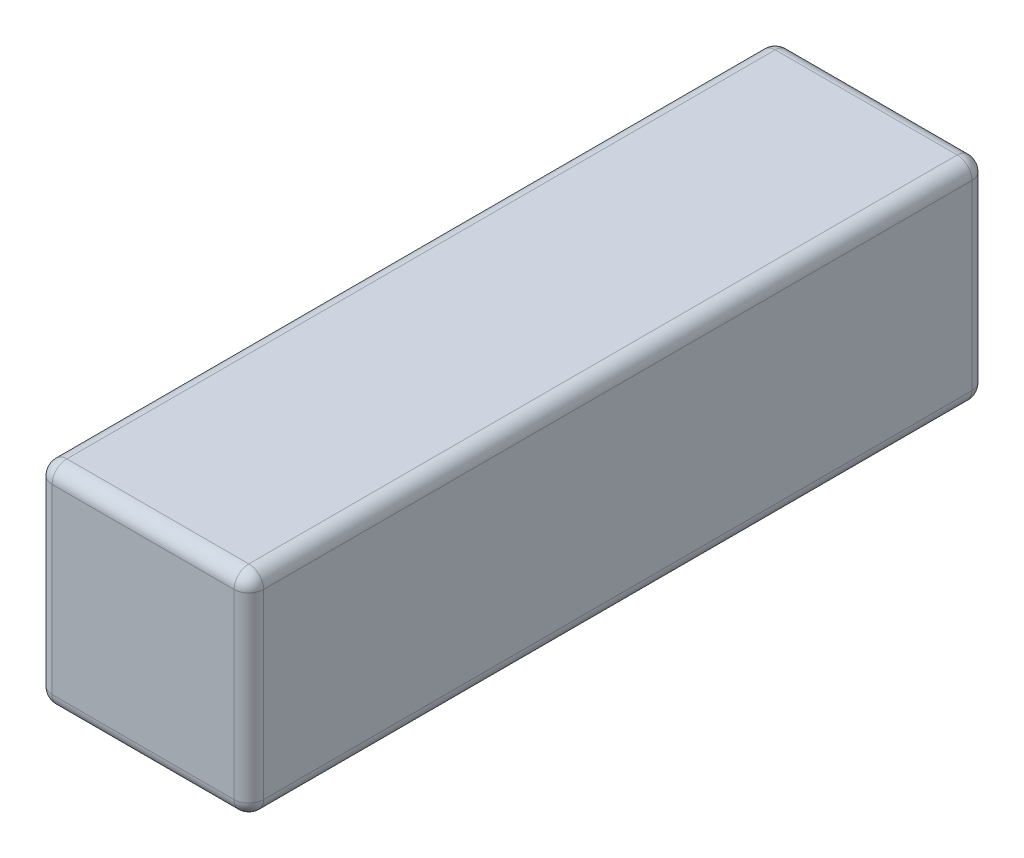
ISO-10303-21;
HEADER;
FILE_DESCRIPTION(('STEP AP214'),'2;1');
FILE_NAME('part.step','',(''),(''),'','','');
FILE_SCHEMA(('AUTOMOTIVE_DESIGN { 1 0 10303 214 1 1 1 1 }'));
ENDSEC;
DATA;
#1=APPLICATION_CONTEXT('core data for automotive mechanical design processes');
#2=APPLICATION_PROTOCOL_DEFINITION('international standard','automotive_design',2000,#1);
#3=PRODUCT_CONTEXT('',#1,'mechanical');
#4=PRODUCT('Part','Part','',(#3));
#5=PRODUCT_RELATED_PRODUCT_CATEGORY('part','',(#4));
#6=PRODUCT_DEFINITION_FORMATION('','',#4);
#7=PRODUCT_DEFINITION_CONTEXT('part definition',#1,'design');
#8=PRODUCT_DEFINITION('design','',#6,#7);
#9=PRODUCT_DEFINITION_SHAPE('','',#8);
#10=(LENGTH_UNIT() NAMED_UNIT(*) SI_UNIT(.MILLI.,.METRE.));
#11=(NAMED_UNIT(*) PLANE_ANGLE_UNIT() SI_UNIT($,.RADIAN.));
#12=(NAMED_UNIT(*) SI_UNIT($,.STERADIAN.) SOLID_ANGLE_UNIT());
#13=UNCERTAINTY_MEASURE_WITH_UNIT(LENGTH_MEASURE(1.E-05),#10,'distance_accuracy_value','');
#14=(GEOMETRIC_REPRESENTATION_CONTEXT(3) GLOBAL_UNCERTAINTY_ASSIGNED_CONTEXT((#13)) GLOBAL_UNIT_ASSIGNED_CONTEXT((#10,
#11,#12)) REPRESENTATION_CONTEXT('',''));
#15=CARTESIAN_POINT('',(0.,0.,0.));
#16=DIRECTION('',(0.,0.,1.));
#17=DIRECTION('',(1.,0.,0.));
#18=AXIS2_PLACEMENT_3D('',#15,#16,#17);
#19=CARTESIAN_POINT('',(-18.5,21.5,72.));
#20=DIRECTION('',(0.,-1.,0.));
#21=DIRECTION('',(0.,0.,-1.));
#22=AXIS2_PLACEMENT_3D('',#19,#20,#21);
#23=CYLINDRICAL_SURFACE('',#22,3.);
#24=DIRECTION('',(0.,-1.,0.));
#25=VECTOR('',#24,1.);
#26=CARTESIAN_POINT('',(-21.5,21.5,72.));
#27=LINE('',#26,#25);
#28=CARTESIAN_POINT('',(-21.5,18.5,72.));
#29=VERTEX_POINT('',#28);
#30=CARTESIAN_POINT('',(-21.5,-18.5,72.));
#31=VERTEX_POINT('',#30);
#32=EDGE_CURVE('E240',#29,#31,#27,.T.);
#33=ORIENTED_EDGE('',*,*,#32,.T.);
#34=CARTESIAN_POINT('',(-18.5,-18.5,72.));
#35=DIRECTION('',(0.,-1.,0.));
#36=DIRECTION('',(0.,0.,-1.));
#37=AXIS2_PLACEMENT_3D('',#34,#35,#36);
#38=CIRCLE('',#37,3.);
#39=CARTESIAN_POINT('',(-18.5,-18.5,75.));
#40=VERTEX_POINT('',#39);
#41=EDGE_CURVE('E295',#31,#40,#38,.F.);
#42=ORIENTED_EDGE('',*,*,#41,.T.);
#43=DIRECTION('',(0.,-1.,0.));
#44=VECTOR('',#43,1.);
#45=CARTESIAN_POINT('',(-18.5,21.5,75.));
#46=LINE('',#45,#44);
#47=CARTESIAN_POINT('',(-18.5,18.5,75.));
#48=VERTEX_POINT('',#47);
#49=EDGE_CURVE('E169',#48,#40,#46,.T.);
#50=ORIENTED_EDGE('',*,*,#49,.F.);
#51=CARTESIAN_POINT('',(-18.5,18.5,72.));
#52=DIRECTION('',(0.,-1.,0.));
#53=DIRECTION('',(0.,0.,-1.));
#54=AXIS2_PLACEMENT_3D('',#51,#52,#53);
#55=CIRCLE('',#54,3.);
#56=EDGE_CURVE('E292',#48,#29,#55,.T.);
#57=ORIENTED_EDGE('',*,*,#56,.T.);
#58=EDGE_LOOP('',(#33,#42,#50,#57));
#59=FACE_BOUND('',#58,.T.);
#60=ADVANCED_FACE('F45',(#59),#23,.T.);
#61=CARTESIAN_POINT('',(-18.5,21.5,75.));
#62=DIRECTION('',(0.,0.,-1.));
#63=DIRECTION('',(-1.,0.,0.));
#64=AXIS2_PLACEMENT_3D('',#61,#62,#63);
#65=PLANE('',#64);
#66=ORIENTED_EDGE('',*,*,#49,.T.);
#67=DIRECTION('',(1.,0.,0.));
#68=VECTOR('',#67,1.);
#69=CARTESIAN_POINT('',(-18.5,-18.5,75.));
#70=LINE('',#69,#68);
#71=CARTESIAN_POINT('',(18.5,-18.5,75.));
#72=VERTEX_POINT('',#71);
#73=EDGE_CURVE('E276',#40,#72,#70,.T.);
#74=ORIENTED_EDGE('',*,*,#73,.T.);
#75=DIRECTION('',(0.,-1.,0.));
#76=VECTOR('',#75,1.);
#77=CARTESIAN_POINT('',(18.5,21.5,75.));
#78=LINE('',#77,#76);
#79=CARTESIAN_POINT('',(18.5,18.5,75.));
#80=VERTEX_POINT('',#79);
#81=EDGE_CURVE('E160',#80,#72,#78,.T.);
#82=ORIENTED_EDGE('',*,*,#81,.F.);
#83=DIRECTION('',(1.,0.,0.));
#84=VECTOR('',#83,1.);
#85=CARTESIAN_POINT('',(-18.5,18.5,75.));
#86=LINE('',#85,#84);
#87=EDGE_CURVE('E273',#80,#48,#86,.F.);
#88=ORIENTED_EDGE('',*,*,#87,.T.);
#89=EDGE_LOOP('',(#66,#74,#82,#88));
#90=FACE_BOUND('',#89,.T.);
#91=ADVANCED_FACE('F336',(#90),#65,.F.);
#92=CARTESIAN_POINT('',(18.5,21.5,72.));
#93=DIRECTION('',(0.,-1.,0.));
#94=DIRECTION('',(0.,0.,-1.));
#95=AXIS2_PLACEMENT_3D('',#92,#93,#94);
#96=CYLINDRICAL_SURFACE('',#95,3.);
#97=ORIENTED_EDGE('',*,*,#81,.T.);
#98=CARTESIAN_POINT('',(18.5,-18.5,72.));
#99=DIRECTION('',(0.,-1.,0.));
#100=DIRECTION('',(0.,0.,-1.));
#101=AXIS2_PLACEMENT_3D('',#98,#99,#100);
#102=CIRCLE('',#101,3.);
#103=CARTESIAN_POINT('',(21.5,-18.5,72.));
#104=VERTEX_POINT('',#103);
#105=EDGE_CURVE('E158',#72,#104,#102,.F.);
#106=ORIENTED_EDGE('',*,*,#105,.T.);
#107=DIRECTION('',(0.,-1.,0.));
#108=VECTOR('',#107,1.);
#109=CARTESIAN_POINT('',(21.5,21.5,72.));
#110=LINE('',#109,#108);
#111=CARTESIAN_POINT('',(21.5,18.5,72.));
#112=VERTEX_POINT('',#111);
#113=EDGE_CURVE('E139',#112,#104,#110,.T.);
#114=ORIENTED_EDGE('',*,*,#113,.F.);
#115=CARTESIAN_POINT('',(18.5,18.5,72.));
#116=DIRECTION('',(0.,-1.,0.));
#117=DIRECTION('',(0.,0.,-1.));
#118=AXIS2_PLACEMENT_3D('',#115,#116,#117);
#119=CIRCLE('',#118,3.);
#120=EDGE_CURVE('E155',#112,#80,#119,.T.);
#121=ORIENTED_EDGE('',*,*,#120,.T.);
#122=EDGE_LOOP('',(#97,#106,#114,#121));
#123=FACE_BOUND('',#122,.T.);
#124=ADVANCED_FACE('F154',(#123),#96,.T.);
#125=CARTESIAN_POINT('',(21.5,21.5,72.));
#126=DIRECTION('',(-1.,0.,0.));
#127=DIRECTION('',(0.,0.,1.));
#128=AXIS2_PLACEMENT_3D('',#125,#126,#127);
#129=PLANE('',#128);
#130=ORIENTED_EDGE('',*,*,#113,.T.);
#131=DIRECTION('',(0.,0.,-1.));
#132=VECTOR('',#131,1.);
#133=CARTESIAN_POINT('',(21.5,-18.5,72.));
#134=LINE('',#133,#132);
#135=CARTESIAN_POINT('',(21.5,-18.5,-72.));
#136=VERTEX_POINT('',#135);
#137=EDGE_CURVE('E11',#104,#136,#134,.T.);
#138=ORIENTED_EDGE('',*,*,#137,.T.);
#139=DIRECTION('',(0.,-1.,0.));
#140=VECTOR('',#139,1.);
#141=CARTESIAN_POINT('',(21.5,21.5,-72.));
#142=LINE('',#141,#140);
#143=CARTESIAN_POINT('',(21.5,18.5,-72.));
#144=VERTEX_POINT('',#143);
#145=EDGE_CURVE('E141',#144,#136,#142,.T.);
#146=ORIENTED_EDGE('',*,*,#145,.F.);
#147=DIRECTION('',(0.,0.,-1.));
#148=VECTOR('',#147,1.);
#149=CARTESIAN_POINT('',(21.5,18.5,72.));
#150=LINE('',#149,#148);
#151=EDGE_CURVE('E55',#144,#112,#150,.F.);
#152=ORIENTED_EDGE('',*,*,#151,.T.);
#153=EDGE_LOOP('',(#130,#138,#146,#152));
#154=FACE_BOUND('',#153,.T.);
#155=ADVANCED_FACE('F138',(#154),#129,.F.);
#156=CARTESIAN_POINT('',(18.5,21.5,-72.));
#157=DIRECTION('',(0.,-1.,0.));
#158=DIRECTION('',(0.,0.,-1.));
#159=AXIS2_PLACEMENT_3D('',#156,#157,#158);
#160=CYLINDRICAL_SURFACE('',#159,3.);
#161=ORIENTED_EDGE('',*,*,#145,.T.);
#162=CARTESIAN_POINT('',(18.5,-18.5,-72.));
#163=DIRECTION('',(0.,-1.,0.));
#164=DIRECTION('',(0.,0.,-1.));
#165=AXIS2_PLACEMENT_3D('',#162,#163,#164);
#166=CIRCLE('',#165,3.);
#167=CARTESIAN_POINT('',(18.5,-18.5,-75.));
#168=VERTEX_POINT('',#167);
#169=EDGE_CURVE('E319',#136,#168,#166,.F.);
#170=ORIENTED_EDGE('',*,*,#169,.T.);
#171=DIRECTION('',(0.,-1.,0.));
#172=VECTOR('',#171,1.);
#173=CARTESIAN_POINT('',(18.5,21.5,-75.));
#174=LINE('',#173,#172);
#175=CARTESIAN_POINT('',(18.5,18.5,-75.));
#176=VERTEX_POINT('',#175);
#177=EDGE_CURVE('E260',#176,#168,#174,.T.);
#178=ORIENTED_EDGE('',*,*,#177,.F.);
#179=CARTESIAN_POINT('',(18.5,18.5,-72.));
#180=DIRECTION('',(0.,-1.,0.));
#181=DIRECTION('',(0.,0.,-1.));
#182=AXIS2_PLACEMENT_3D('',#179,#180,#181);
#183=CIRCLE('',#182,3.);
#184=EDGE_CURVE('E316',#176,#144,#183,.T.);
#185=ORIENTED_EDGE('',*,*,#184,.T.);
#186=EDGE_LOOP('',(#161,#170,#178,#185));
#187=FACE_BOUND('',#186,.T.);
#188=ADVANCED_FACE('F359',(#187),#160,.T.);
#189=CARTESIAN_POINT('',(-18.5,21.5,-75.));
#190=DIRECTION('',(0.,0.,1.));
#191=DIRECTION('',(1.,0.,0.));
#192=AXIS2_PLACEMENT_3D('',#189,#190,#191);
#193=PLANE('',#192);
#194=ORIENTED_EDGE('',*,*,#177,.T.);
#195=DIRECTION('',(-1.,0.,0.));
#196=VECTOR('',#195,1.);
#197=CARTESIAN_POINT('',(-18.5,-18.5,-75.));
#198=LINE('',#197,#196);
#199=CARTESIAN_POINT('',(-18.5,-18.5,-75.));
#200=VERTEX_POINT('',#199);
#201=EDGE_CURVE('E313',#168,#200,#198,.T.);
#202=ORIENTED_EDGE('',*,*,#201,.T.);
#203=DIRECTION('',(0.,-1.,0.));
#204=VECTOR('',#203,1.);
#205=CARTESIAN_POINT('',(-18.5,21.5,-75.));
#206=LINE('',#205,#204);
#207=CARTESIAN_POINT('',(-18.5,18.5,-75.));
#208=VERTEX_POINT('',#207);
#209=EDGE_CURVE('E254',#208,#200,#206,.T.);
#210=ORIENTED_EDGE('',*,*,#209,.F.);
#211=DIRECTION('',(-1.,0.,0.));
#212=VECTOR('',#211,1.);
#213=CARTESIAN_POINT('',(18.5,18.5,-75.));
#214=LINE('',#213,#212);
#215=EDGE_CURVE('E310',#208,#176,#214,.F.);
#216=ORIENTED_EDGE('',*,*,#215,.T.);
#217=EDGE_LOOP('',(#194,#202,#210,#216));
#218=FACE_BOUND('',#217,.T.);
#219=ADVANCED_FACE('F357',(#218),#193,.F.);
#220=CARTESIAN_POINT('',(-18.5,21.5,-72.));
#221=DIRECTION('',(0.,-1.,0.));
#222=DIRECTION('',(0.,0.,-1.));
#223=AXIS2_PLACEMENT_3D('',#220,#221,#222);
#224=CYLINDRICAL_SURFACE('',#223,3.);
#225=ORIENTED_EDGE('',*,*,#209,.T.);
#226=CARTESIAN_POINT('',(-18.5,-18.5,-72.));
#227=DIRECTION('',(0.,-1.,0.));
#228=DIRECTION('',(0.,0.,-1.));
#229=AXIS2_PLACEMENT_3D('',#226,#227,#228);
#230=CIRCLE('',#229,3.);
#231=CARTESIAN_POINT('',(-21.5,-18.5,-72.));
#232=VERTEX_POINT('',#231);
#233=EDGE_CURVE('E307',#200,#232,#230,.F.);
#234=ORIENTED_EDGE('',*,*,#233,.T.);
#235=DIRECTION('',(0.,-1.,0.));
#236=VECTOR('',#235,1.);
#237=CARTESIAN_POINT('',(-21.5,21.5,-72.));
#238=LINE('',#237,#236);
#239=CARTESIAN_POINT('',(-21.5,18.5,-72.));
#240=VERTEX_POINT('',#239);
#241=EDGE_CURVE('E247',#240,#232,#238,.T.);
#242=ORIENTED_EDGE('',*,*,#241,.F.);
#243=CARTESIAN_POINT('',(-18.5,18.5,-72.));
#244=DIRECTION('',(0.,-1.,0.));
#245=DIRECTION('',(0.,0.,-1.));
#246=AXIS2_PLACEMENT_3D('',#243,#244,#245);
#247=CIRCLE('',#246,3.);
#248=EDGE_CURVE('E304',#240,#208,#247,.T.);
#249=ORIENTED_EDGE('',*,*,#248,.T.);
#250=EDGE_LOOP('',(#225,#234,#242,#249));
#251=FACE_BOUND('',#250,.T.);
#252=ADVANCED_FACE('F348',(#251),#224,.T.);
#253=CARTESIAN_POINT('',(-21.5,21.5,72.));
#254=DIRECTION('',(1.,0.,0.));
#255=DIRECTION('',(0.,0.,-1.));
#256=AXIS2_PLACEMENT_3D('',#253,#254,#255);
#257=PLANE('',#256);
#258=ORIENTED_EDGE('',*,*,#241,.T.);
#259=DIRECTION('',(0.,0.,1.));
#260=VECTOR('',#259,1.);
#261=CARTESIAN_POINT('',(-21.5,-18.5,72.));
#262=LINE('',#261,#260);
#263=EDGE_CURVE('E301',#232,#31,#262,.T.);
#264=ORIENTED_EDGE('',*,*,#263,.T.);
#265=ORIENTED_EDGE('',*,*,#32,.F.);
#266=DIRECTION('',(0.,0.,1.));
#267=VECTOR('',#266,1.);
#268=CARTESIAN_POINT('',(-21.5,18.5,-72.));
#269=LINE('',#268,#267);
#270=EDGE_CURVE('E298',#29,#240,#269,.F.);
#271=ORIENTED_EDGE('',*,*,#270,.T.);
#272=EDGE_LOOP('',(#258,#264,#265,#271));
#273=FACE_BOUND('',#272,.T.);
#274=ADVANCED_FACE('F345',(#273),#257,.F.);
#275=CARTESIAN_POINT('',(-18.5,21.5,72.));
#276=DIRECTION('',(0.,1.,0.));
#277=DIRECTION('',(0.,0.,1.));
#278=AXIS2_PLACEMENT_3D('',#275,#276,#277);
#279=PLANE('',#278);
#280=DIRECTION('',(0.,0.,1.));
#281=VECTOR('',#280,1.);
#282=CARTESIAN_POINT('',(-18.5,21.5,72.));
#283=LINE('',#282,#281);
#284=CARTESIAN_POINT('',(-18.5,21.5,-72.));
#285=VERTEX_POINT('',#284);
#286=CARTESIAN_POINT('',(-18.5,21.5,72.));
#287=VERTEX_POINT('',#286);
#288=EDGE_CURVE('E63',#285,#287,#283,.T.);
#289=ORIENTED_EDGE('',*,*,#288,.T.);
#290=DIRECTION('',(1.,0.,0.));
#291=VECTOR('',#290,1.);
#292=CARTESIAN_POINT('',(18.5,21.5,72.));
#293=LINE('',#292,#291);
#294=CARTESIAN_POINT('',(18.5,21.5,72.));
#295=VERTEX_POINT('',#294);
#296=EDGE_CURVE('E147',#287,#295,#293,.T.);
#297=ORIENTED_EDGE('',*,*,#296,.T.);
#298=DIRECTION('',(0.,0.,-1.));
#299=VECTOR('',#298,1.);
#300=CARTESIAN_POINT('',(18.5,21.5,-72.));
#301=LINE('',#300,#299);
#302=CARTESIAN_POINT('',(18.5,21.5,-72.));
#303=VERTEX_POINT('',#302);
#304=EDGE_CURVE('E173',#295,#303,#301,.T.);
#305=ORIENTED_EDGE('',*,*,#304,.T.);
#306=DIRECTION('',(-1.,0.,0.));
#307=VECTOR('',#306,1.);
#308=CARTESIAN_POINT('',(-18.5,21.5,-72.));
#309=LINE('',#308,#307);
#310=EDGE_CURVE('E68',#303,#285,#309,.T.);
#311=ORIENTED_EDGE('',*,*,#310,.T.);
#312=EDGE_LOOP('',(#289,#297,#305,#311));
#313=FACE_BOUND('',#312,.T.);
#314=ADVANCED_FACE('F330',(#313),#279,.T.);
#315=CARTESIAN_POINT('',(-18.5,-21.5,72.));
#316=DIRECTION('',(0.,1.,0.));
#317=DIRECTION('',(0.,0.,1.));
#318=AXIS2_PLACEMENT_3D('',#315,#316,#317);
#319=PLANE('',#318);
#320=DIRECTION('',(0.,0.,-1.));
#321=VECTOR('',#320,1.);
#322=CARTESIAN_POINT('',(18.5,-21.5,72.));
#323=LINE('',#322,#321);
#324=CARTESIAN_POINT('',(18.5,-21.5,-72.));
#325=VERTEX_POINT('',#324);
#326=CARTESIAN_POINT('',(18.5,-21.5,72.));
#327=VERTEX_POINT('',#326);
#328=EDGE_CURVE('E279',#325,#327,#323,.F.);
#329=ORIENTED_EDGE('',*,*,#328,.T.);
#330=DIRECTION('',(1.,0.,0.));
#331=VECTOR('',#330,1.);
#332=CARTESIAN_POINT('',(-18.5,-21.5,72.));
#333=LINE('',#332,#331);
#334=CARTESIAN_POINT('',(-18.5,-21.5,72.));
#335=VERTEX_POINT('',#334);
#336=EDGE_CURVE('E288',#327,#335,#333,.F.);
#337=ORIENTED_EDGE('',*,*,#336,.T.);
#338=DIRECTION('',(0.,0.,1.));
#339=VECTOR('',#338,1.);
#340=CARTESIAN_POINT('',(-18.5,-21.5,72.));
#341=LINE('',#340,#339);
#342=CARTESIAN_POINT('',(-18.5,-21.5,-72.));
#343=VERTEX_POINT('',#342);
#344=EDGE_CURVE('E285',#335,#343,#341,.F.);
#345=ORIENTED_EDGE('',*,*,#344,.T.);
#346=DIRECTION('',(-1.,0.,0.));
#347=VECTOR('',#346,1.);
#348=CARTESIAN_POINT('',(-18.5,-21.5,-72.));
#349=LINE('',#348,#347);
#350=EDGE_CURVE('E282',#343,#325,#349,.F.);
#351=ORIENTED_EDGE('',*,*,#350,.T.);
#352=EDGE_LOOP('',(#329,#337,#345,#351));
#353=FACE_BOUND('',#352,.T.);
#354=ADVANCED_FACE('F370',(#353),#319,.F.);
#355=CARTESIAN_POINT('',(-18.5,-18.5,-72.));
#356=DIRECTION('',(0.,1.,0.));
#357=DIRECTION('',(0.,0.,1.));
#358=AXIS2_PLACEMENT_3D('',#355,#356,#357);
#359=SPHERICAL_SURFACE('',#358,3.);
#360=CARTESIAN_POINT('',(-18.5,-18.5,-72.));
#361=DIRECTION('',(1.,0.,0.));
#362=DIRECTION('',(0.,0.,-1.));
#363=AXIS2_PLACEMENT_3D('',#360,#361,#362);
#364=CIRCLE('',#363,3.);
#365=EDGE_CURVE('E231',#343,#200,#364,.T.);
#366=ORIENTED_EDGE('',*,*,#365,.F.);
#367=CARTESIAN_POINT('',(-18.5,-18.5,-72.));
#368=DIRECTION('',(0.,0.,1.));
#369=DIRECTION('',(1.,0.,0.));
#370=AXIS2_PLACEMENT_3D('',#367,#368,#369);
#371=CIRCLE('',#370,3.);
#372=EDGE_CURVE('E180',#232,#343,#371,.T.);
#373=ORIENTED_EDGE('',*,*,#372,.F.);
#374=ORIENTED_EDGE('',*,*,#233,.F.);
#375=EDGE_LOOP('',(#366,#373,#374));
#376=FACE_BOUND('',#375,.T.);
#377=ADVANCED_FACE('F404',(#376),#359,.T.);
#378=CARTESIAN_POINT('',(-18.5,-18.5,72.));
#379=DIRECTION('',(0.,0.,1.));
#380=DIRECTION('',(1.,0.,0.));
#381=AXIS2_PLACEMENT_3D('',#378,#379,#380);
#382=CYLINDRICAL_SURFACE('',#381,3.);
#383=ORIENTED_EDGE('',*,*,#372,.T.);
#384=ORIENTED_EDGE('',*,*,#344,.F.);
#385=CARTESIAN_POINT('',(-18.5,-18.5,72.));
#386=DIRECTION('',(0.,0.,1.));
#387=DIRECTION('',(1.,0.,0.));
#388=AXIS2_PLACEMENT_3D('',#385,#386,#387);
#389=CIRCLE('',#388,3.);
#390=EDGE_CURVE('E228',#31,#335,#389,.T.);
#391=ORIENTED_EDGE('',*,*,#390,.F.);
#392=ORIENTED_EDGE('',*,*,#263,.F.);
#393=EDGE_LOOP('',(#383,#384,#391,#392));
#394=FACE_BOUND('',#393,.T.);
#395=ADVANCED_FACE('F422',(#394),#382,.T.);
#396=CARTESIAN_POINT('',(-18.5,-18.5,-72.));
#397=DIRECTION('',(-1.,0.,0.));
#398=DIRECTION('',(0.,0.,1.));
#399=AXIS2_PLACEMENT_3D('',#396,#397,#398);
#400=CYLINDRICAL_SURFACE('',#399,3.);
#401=ORIENTED_EDGE('',*,*,#365,.T.);
#402=ORIENTED_EDGE('',*,*,#201,.F.);
#403=CARTESIAN_POINT('',(18.5,-18.5,-72.));
#404=DIRECTION('',(1.,0.,0.));
#405=DIRECTION('',(0.,0.,-1.));
#406=AXIS2_PLACEMENT_3D('',#403,#404,#405);
#407=CIRCLE('',#406,3.);
#408=EDGE_CURVE('E224',#325,#168,#407,.T.);
#409=ORIENTED_EDGE('',*,*,#408,.F.);
#410=ORIENTED_EDGE('',*,*,#350,.F.);
#411=EDGE_LOOP('',(#401,#402,#409,#410));
#412=FACE_BOUND('',#411,.T.);
#413=ADVANCED_FACE('F431',(#412),#400,.T.);
#414=CARTESIAN_POINT('',(-18.5,-18.5,72.));
#415=DIRECTION('',(0.,1.,0.));
#416=DIRECTION('',(0.,0.,1.));
#417=AXIS2_PLACEMENT_3D('',#414,#415,#416);
#418=SPHERICAL_SURFACE('',#417,3.);
#419=ORIENTED_EDGE('',*,*,#41,.F.);
#420=ORIENTED_EDGE('',*,*,#390,.T.);
#421=CARTESIAN_POINT('',(-18.5,-18.5,72.));
#422=DIRECTION('',(1.,0.,0.));
#423=DIRECTION('',(0.,0.,-1.));
#424=AXIS2_PLACEMENT_3D('',#421,#422,#423);
#425=CIRCLE('',#424,3.);
#426=EDGE_CURVE('E221',#40,#335,#425,.T.);
#427=ORIENTED_EDGE('',*,*,#426,.F.);
#428=EDGE_LOOP('',(#419,#420,#427));
#429=FACE_BOUND('',#428,.T.);
#430=ADVANCED_FACE('F439',(#429),#418,.T.);
#431=CARTESIAN_POINT('',(18.5,-18.5,-72.));
#432=DIRECTION('',(0.,1.,0.));
#433=DIRECTION('',(0.,0.,1.));
#434=AXIS2_PLACEMENT_3D('',#431,#432,#433);
#435=SPHERICAL_SURFACE('',#434,3.);
#436=ORIENTED_EDGE('',*,*,#408,.T.);
#437=ORIENTED_EDGE('',*,*,#169,.F.);
#438=CARTESIAN_POINT('',(18.5,-18.5,-72.));
#439=DIRECTION('',(0.,0.,1.));
#440=DIRECTION('',(1.,0.,0.));
#441=AXIS2_PLACEMENT_3D('',#438,#439,#440);
#442=CIRCLE('',#441,3.);
#443=EDGE_CURVE('E215',#325,#136,#442,.T.);
#444=ORIENTED_EDGE('',*,*,#443,.F.);
#445=EDGE_LOOP('',(#436,#437,#444));
#446=FACE_BOUND('',#445,.T.);
#447=ADVANCED_FACE('F363',(#446),#435,.T.);
#448=CARTESIAN_POINT('',(-18.5,-18.5,72.));
#449=DIRECTION('',(1.,0.,0.));
#450=DIRECTION('',(0.,0.,-1.));
#451=AXIS2_PLACEMENT_3D('',#448,#449,#450);
#452=CYLINDRICAL_SURFACE('',#451,3.);
#453=ORIENTED_EDGE('',*,*,#426,.T.);
#454=ORIENTED_EDGE('',*,*,#336,.F.);
#455=CARTESIAN_POINT('',(18.5,-18.5,72.));
#456=DIRECTION('',(1.,0.,0.));
#457=DIRECTION('',(0.,0.,-1.));
#458=AXIS2_PLACEMENT_3D('',#455,#456,#457);
#459=CIRCLE('',#458,3.);
#460=EDGE_CURVE('E208',#72,#327,#459,.T.);
#461=ORIENTED_EDGE('',*,*,#460,.F.);
#462=ORIENTED_EDGE('',*,*,#73,.F.);
#463=EDGE_LOOP('',(#453,#454,#461,#462));
#464=FACE_BOUND('',#463,.T.);
#465=ADVANCED_FACE('F373',(#464),#452,.T.);
#466=CARTESIAN_POINT('',(18.5,-18.5,72.));
#467=DIRECTION('',(0.,0.,-1.));
#468=DIRECTION('',(-1.,0.,0.));
#469=AXIS2_PLACEMENT_3D('',#466,#467,#468);
#470=CYLINDRICAL_SURFACE('',#469,3.);
#471=ORIENTED_EDGE('',*,*,#443,.T.);
#472=ORIENTED_EDGE('',*,*,#137,.F.);
#473=CARTESIAN_POINT('',(18.5,-18.5,72.));
#474=DIRECTION('',(0.,0.,1.));
#475=DIRECTION('',(1.,0.,0.));
#476=AXIS2_PLACEMENT_3D('',#473,#474,#475);
#477=CIRCLE('',#476,3.);
#478=EDGE_CURVE('E204',#327,#104,#477,.T.);
#479=ORIENTED_EDGE('',*,*,#478,.F.);
#480=ORIENTED_EDGE('',*,*,#328,.F.);
#481=EDGE_LOOP('',(#471,#472,#479,#480));
#482=FACE_BOUND('',#481,.T.);
#483=ADVANCED_FACE('F367',(#482),#470,.T.);
#484=CARTESIAN_POINT('',(18.5,-18.5,72.));
#485=DIRECTION('',(0.,1.,0.));
#486=DIRECTION('',(0.,0.,1.));
#487=AXIS2_PLACEMENT_3D('',#484,#485,#486);
#488=SPHERICAL_SURFACE('',#487,3.);
#489=ORIENTED_EDGE('',*,*,#105,.F.);
#490=ORIENTED_EDGE('',*,*,#460,.T.);
#491=ORIENTED_EDGE('',*,*,#478,.T.);
#492=EDGE_LOOP('',(#489,#490,#491));
#493=FACE_BOUND('',#492,.T.);
#494=ADVANCED_FACE('F375',(#493),#488,.T.);
#495=CARTESIAN_POINT('',(-18.5,18.5,-72.));
#496=DIRECTION('',(0.,1.,0.));
#497=DIRECTION('',(0.,0.,1.));
#498=AXIS2_PLACEMENT_3D('',#495,#496,#497);
#499=SPHERICAL_SURFACE('',#498,3.);
#500=CARTESIAN_POINT('',(-18.5,18.5,-72.));
#501=DIRECTION('',(1.,0.,0.));
#502=DIRECTION('',(0.,0.,-1.));
#503=AXIS2_PLACEMENT_3D('',#500,#501,#502);
#504=CIRCLE('',#503,3.);
#505=EDGE_CURVE('E196',#208,#285,#504,.T.);
#506=ORIENTED_EDGE('',*,*,#505,.F.);
#507=ORIENTED_EDGE('',*,*,#248,.F.);
#508=CARTESIAN_POINT('',(-18.5,18.5,-72.));
#509=DIRECTION('',(0.,0.,1.));
#510=DIRECTION('',(1.,0.,0.));
#511=AXIS2_PLACEMENT_3D('',#508,#509,#510);
#512=CIRCLE('',#511,3.);
#513=EDGE_CURVE('E49',#285,#240,#512,.T.);
#514=ORIENTED_EDGE('',*,*,#513,.F.);
#515=EDGE_LOOP('',(#506,#507,#514));
#516=FACE_BOUND('',#515,.T.);
#517=ADVANCED_FACE('F47',(#516),#499,.T.);
#518=CARTESIAN_POINT('',(-18.5,18.5,72.));
#519=DIRECTION('',(0.,0.,-1.));
#520=DIRECTION('',(-1.,0.,0.));
#521=AXIS2_PLACEMENT_3D('',#518,#519,#520);
#522=CYLINDRICAL_SURFACE('',#521,3.);
#523=ORIENTED_EDGE('',*,*,#513,.T.);
#524=ORIENTED_EDGE('',*,*,#270,.F.);
#525=CARTESIAN_POINT('',(-18.5,18.5,72.));
#526=DIRECTION('',(0.,0.,1.));
#527=DIRECTION('',(1.,0.,0.));
#528=AXIS2_PLACEMENT_3D('',#525,#526,#527);
#529=CIRCLE('',#528,3.);
#530=EDGE_CURVE('E193',#287,#29,#529,.T.);
#531=ORIENTED_EDGE('',*,*,#530,.F.);
#532=ORIENTED_EDGE('',*,*,#288,.F.);
#533=EDGE_LOOP('',(#523,#524,#531,#532));
#534=FACE_BOUND('',#533,.T.);
#535=ADVANCED_FACE('F342',(#534),#522,.T.);
#536=CARTESIAN_POINT('',(-18.5,18.5,-72.));
#537=DIRECTION('',(1.,0.,0.));
#538=DIRECTION('',(0.,0.,-1.));
#539=AXIS2_PLACEMENT_3D('',#536,#537,#538);
#540=CYLINDRICAL_SURFACE('',#539,3.);
#541=ORIENTED_EDGE('',*,*,#505,.T.);
#542=ORIENTED_EDGE('',*,*,#310,.F.);
#543=CARTESIAN_POINT('',(18.5,18.5,-72.));
#544=DIRECTION('',(1.,0.,0.));
#545=DIRECTION('',(0.,0.,-1.));
#546=AXIS2_PLACEMENT_3D('',#543,#544,#545);
#547=CIRCLE('',#546,3.);
#548=EDGE_CURVE('E189',#176,#303,#547,.T.);
#549=ORIENTED_EDGE('',*,*,#548,.F.);
#550=ORIENTED_EDGE('',*,*,#215,.F.);
#551=EDGE_LOOP('',(#541,#542,#549,#550));
#552=FACE_BOUND('',#551,.T.);
#553=ADVANCED_FACE('F353',(#552),#540,.T.);
#554=CARTESIAN_POINT('',(-18.5,18.5,72.));
#555=DIRECTION('',(0.,1.,0.));
#556=DIRECTION('',(0.,0.,1.));
#557=AXIS2_PLACEMENT_3D('',#554,#555,#556);
#558=SPHERICAL_SURFACE('',#557,3.);
#559=ORIENTED_EDGE('',*,*,#530,.T.);
#560=ORIENTED_EDGE('',*,*,#56,.F.);
#561=CARTESIAN_POINT('',(-18.5,18.5,72.));
#562=DIRECTION('',(1.,0.,0.));
#563=DIRECTION('',(0.,0.,-1.));
#564=AXIS2_PLACEMENT_3D('',#561,#562,#563);
#565=CIRCLE('',#564,3.);
#566=EDGE_CURVE('E185',#287,#48,#565,.T.);
#567=ORIENTED_EDGE('',*,*,#566,.F.);
#568=EDGE_LOOP('',(#559,#560,#567));
#569=FACE_BOUND('',#568,.T.);
#570=ADVANCED_FACE('F341',(#569),#558,.T.);
#571=CARTESIAN_POINT('',(18.5,18.5,-72.));
#572=DIRECTION('',(0.,1.,0.));
#573=DIRECTION('',(0.,0.,1.));
#574=AXIS2_PLACEMENT_3D('',#571,#572,#573);
#575=SPHERICAL_SURFACE('',#574,3.);
#576=ORIENTED_EDGE('',*,*,#184,.F.);
#577=ORIENTED_EDGE('',*,*,#548,.T.);
#578=CARTESIAN_POINT('',(18.5,18.5,-72.));
#579=DIRECTION('',(0.,0.,1.));
#580=DIRECTION('',(1.,0.,0.));
#581=AXIS2_PLACEMENT_3D('',#578,#579,#580);
#582=CIRCLE('',#581,3.);
#583=EDGE_CURVE('E177',#144,#303,#582,.T.);
#584=ORIENTED_EDGE('',*,*,#583,.F.);
#585=EDGE_LOOP('',(#576,#577,#584));
#586=FACE_BOUND('',#585,.T.);
#587=ADVANCED_FACE('F502',(#586),#575,.T.);
#588=CARTESIAN_POINT('',(-18.5,18.5,72.));
#589=DIRECTION('',(-1.,0.,0.));
#590=DIRECTION('',(0.,0.,1.));
#591=AXIS2_PLACEMENT_3D('',#588,#589,#590);
#592=CYLINDRICAL_SURFACE('',#591,3.);
#593=ORIENTED_EDGE('',*,*,#566,.T.);
#594=ORIENTED_EDGE('',*,*,#87,.F.);
#595=CARTESIAN_POINT('',(18.5,18.5,72.));
#596=DIRECTION('',(1.,0.,0.));
#597=DIRECTION('',(0.,0.,-1.));
#598=AXIS2_PLACEMENT_3D('',#595,#596,#597);
#599=CIRCLE('',#598,3.);
#600=EDGE_CURVE('E166',#295,#80,#599,.T.);
#601=ORIENTED_EDGE('',*,*,#600,.F.);
#602=ORIENTED_EDGE('',*,*,#296,.F.);
#603=EDGE_LOOP('',(#593,#594,#601,#602));
#604=FACE_BOUND('',#603,.T.);
#605=ADVANCED_FACE('F332',(#604),#592,.T.);
#606=CARTESIAN_POINT('',(18.5,18.5,72.));
#607=DIRECTION('',(0.,0.,1.));
#608=DIRECTION('',(1.,0.,0.));
#609=AXIS2_PLACEMENT_3D('',#606,#607,#608);
#610=CYLINDRICAL_SURFACE('',#609,3.);
#611=ORIENTED_EDGE('',*,*,#583,.T.);
#612=ORIENTED_EDGE('',*,*,#304,.F.);
#613=CARTESIAN_POINT('',(18.5,18.5,72.));
#614=DIRECTION('',(0.,0.,1.));
#615=DIRECTION('',(1.,0.,0.));
#616=AXIS2_PLACEMENT_3D('',#613,#614,#615);
#617=CIRCLE('',#616,3.);
#618=EDGE_CURVE('E164',#112,#295,#617,.T.);
#619=ORIENTED_EDGE('',*,*,#618,.F.);
#620=ORIENTED_EDGE('',*,*,#151,.F.);
#621=EDGE_LOOP('',(#611,#612,#619,#620));
#622=FACE_BOUND('',#621,.T.);
#623=ADVANCED_FACE('F172',(#622),#610,.T.);
#624=CARTESIAN_POINT('',(18.5,18.5,72.));
#625=DIRECTION('',(0.,1.,0.));
#626=DIRECTION('',(0.,0.,1.));
#627=AXIS2_PLACEMENT_3D('',#624,#625,#626);
#628=SPHERICAL_SURFACE('',#627,3.);
#629=ORIENTED_EDGE('',*,*,#600,.T.);
#630=ORIENTED_EDGE('',*,*,#120,.F.);
#631=ORIENTED_EDGE('',*,*,#618,.T.);
#632=EDGE_LOOP('',(#629,#630,#631));
#633=FACE_BOUND('',#632,.T.);
#634=ADVANCED_FACE('F163',(#633),#628,.T.);
#635=CLOSED_SHELL('',(#60,#91,#124,#155,#188,#219,#252,#274,#314,#354,#377,#395,#413,#430,#447,
#465,#483,#494,#517,#535,#553,#570,#587,#605,#623,#634));
#636=MANIFOLD_SOLID_BREP('B2',#635);
#637=ADVANCED_BREP_SHAPE_REPRESENTATION('',(#18,#636),#14);
#638=SHAPE_DEFINITION_REPRESENTATION(#9,#637);
ENDSEC;
END-ISO-10303-21;
